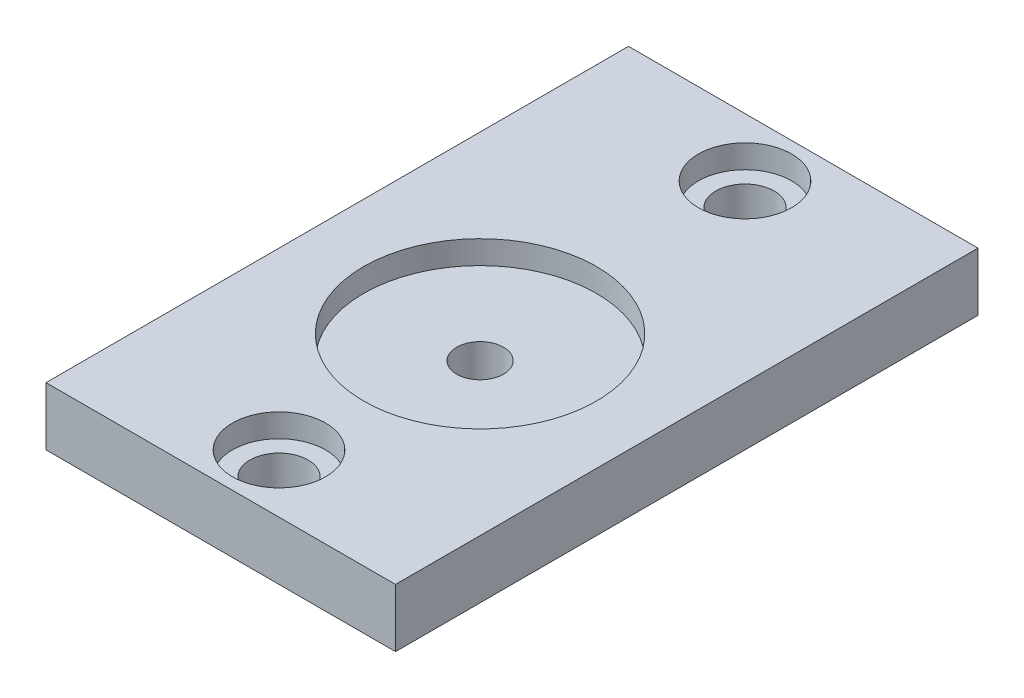
ISO-10303-21;
HEADER;
FILE_DESCRIPTION(('STEP AP214'),'2;1');
FILE_NAME('part.step','',(''),(''),'','','');
FILE_SCHEMA(('AUTOMOTIVE_DESIGN { 1 0 10303 214 1 1 1 1 }'));
ENDSEC;
DATA;
#1=APPLICATION_CONTEXT('core data for automotive mechanical design processes');
#2=APPLICATION_PROTOCOL_DEFINITION('international standard','automotive_design',2000,#1);
#3=PRODUCT_CONTEXT('',#1,'mechanical');
#4=PRODUCT('Part','Part','',(#3));
#5=PRODUCT_RELATED_PRODUCT_CATEGORY('part','',(#4));
#6=PRODUCT_DEFINITION_FORMATION('','',#4);
#7=PRODUCT_DEFINITION_CONTEXT('part definition',#1,'design');
#8=PRODUCT_DEFINITION('design','',#6,#7);
#9=PRODUCT_DEFINITION_SHAPE('','',#8);
#10=(LENGTH_UNIT() NAMED_UNIT(*) SI_UNIT(.MILLI.,.METRE.));
#11=(NAMED_UNIT(*) PLANE_ANGLE_UNIT() SI_UNIT($,.RADIAN.));
#12=(NAMED_UNIT(*) SI_UNIT($,.STERADIAN.) SOLID_ANGLE_UNIT());
#13=UNCERTAINTY_MEASURE_WITH_UNIT(LENGTH_MEASURE(1.E-05),#10,'distance_accuracy_value','');
#14=(GEOMETRIC_REPRESENTATION_CONTEXT(3) GLOBAL_UNCERTAINTY_ASSIGNED_CONTEXT((#13)) GLOBAL_UNIT_ASSIGNED_CONTEXT((#10,
#11,#12)) REPRESENTATION_CONTEXT('',''));
#15=CARTESIAN_POINT('',(0.,0.,0.));
#16=DIRECTION('',(0.,0.,1.));
#17=DIRECTION('',(1.,0.,0.));
#18=AXIS2_PLACEMENT_3D('',#15,#16,#17);
#19=CARTESIAN_POINT('',(412.75,22.225,-2235.2));
#20=DIRECTION('',(0.,1.,0.));
#21=DIRECTION('',(0.,0.,-1.));
#22=AXIS2_PLACEMENT_3D('',#19,#20,#21);
#23=PLANE('',#22);
#24=CARTESIAN_POINT('',(412.75,22.225,-2209.8));
#25=DIRECTION('',(0.,-1.,0.));
#26=DIRECTION('',(-1.,0.,0.));
#27=AXIS2_PLACEMENT_3D('',#24,#25,#26);
#28=CIRCLE('',#27,3.175);
#29=CARTESIAN_POINT('',(415.925,22.225,-2209.8));
#30=VERTEX_POINT('',#29);
#31=EDGE_CURVE('E137',#30,#30,#28,.T.);
#32=ORIENTED_EDGE('',*,*,#31,.F.);
#33=EDGE_LOOP('',(#32));
#34=FACE_BOUND('',#33,.T.);
#35=CARTESIAN_POINT('',(412.75,22.225,-2260.6));
#36=DIRECTION('',(0.,-1.,0.));
#37=DIRECTION('',(-1.,0.,0.));
#38=AXIS2_PLACEMENT_3D('',#35,#36,#37);
#39=CIRCLE('',#38,3.175);
#40=CARTESIAN_POINT('',(415.925,22.225,-2260.6));
#41=VERTEX_POINT('',#40);
#42=EDGE_CURVE('E211',#41,#41,#39,.T.);
#43=ORIENTED_EDGE('',*,*,#42,.F.);
#44=EDGE_LOOP('',(#43));
#45=FACE_BOUND('',#44,.T.);
#46=CARTESIAN_POINT('',(412.75,22.225,-2231.7202));
#47=DIRECTION('',(0.,1.,0.));
#48=DIRECTION('',(-1.,0.,0.));
#49=AXIS2_PLACEMENT_3D('',#46,#47,#48);
#50=CIRCLE('',#49,2.5527);
#51=CARTESIAN_POINT('',(415.3027,22.225,-2231.7202));
#52=VERTEX_POINT('',#51);
#53=EDGE_CURVE('E185',#52,#52,#50,.T.);
#54=ORIENTED_EDGE('',*,*,#53,.T.);
#55=EDGE_LOOP('',(#54));
#56=FACE_BOUND('',#55,.T.);
#57=DIRECTION('',(0.,0.,1.));
#58=VECTOR('',#57,1.);
#59=CARTESIAN_POINT('',(393.7,22.225,-2266.95));
#60=LINE('',#59,#58);
#61=CARTESIAN_POINT('',(393.7,22.225,-2266.95));
#62=VERTEX_POINT('',#61);
#63=CARTESIAN_POINT('',(393.7,22.225,-2203.45));
#64=VERTEX_POINT('',#63);
#65=EDGE_CURVE('E27',#62,#64,#60,.T.);
#66=ORIENTED_EDGE('',*,*,#65,.F.);
#67=DIRECTION('',(-1.,0.,0.));
#68=VECTOR('',#67,1.);
#69=CARTESIAN_POINT('',(431.8,22.225,-2266.95));
#70=LINE('',#69,#68);
#71=CARTESIAN_POINT('',(431.8,22.225,-2266.95));
#72=VERTEX_POINT('',#71);
#73=EDGE_CURVE('E172',#72,#62,#70,.T.);
#74=ORIENTED_EDGE('',*,*,#73,.F.);
#75=DIRECTION('',(0.,0.,-1.));
#76=VECTOR('',#75,1.);
#77=CARTESIAN_POINT('',(431.8,22.225,-2203.45));
#78=LINE('',#77,#76);
#79=CARTESIAN_POINT('',(431.8,22.225,-2203.45));
#80=VERTEX_POINT('',#79);
#81=EDGE_CURVE('E20',#80,#72,#78,.T.);
#82=ORIENTED_EDGE('',*,*,#81,.F.);
#83=DIRECTION('',(1.,0.,0.));
#84=VECTOR('',#83,1.);
#85=CARTESIAN_POINT('',(393.7,22.225,-2203.45));
#86=LINE('',#85,#84);
#87=EDGE_CURVE('E66',#64,#80,#86,.T.);
#88=ORIENTED_EDGE('',*,*,#87,.F.);
#89=EDGE_LOOP('',(#66,#74,#82,#88));
#90=FACE_BOUND('',#89,.T.);
#91=ADVANCED_FACE('F16',(#34,#45,#56,#90),#23,.F.);
#92=CARTESIAN_POINT('',(412.75,28.575,-2235.2));
#93=DIRECTION('',(0.,1.,0.));
#94=DIRECTION('',(0.,0.,-1.));
#95=AXIS2_PLACEMENT_3D('',#92,#93,#94);
#96=PLANE('',#95);
#97=CARTESIAN_POINT('',(412.75,28.575,-2231.7202));
#98=DIRECTION('',(0.,-1.,0.));
#99=DIRECTION('',(1.,0.,0.));
#100=AXIS2_PLACEMENT_3D('',#97,#98,#99);
#101=CIRCLE('',#100,12.7);
#102=CARTESIAN_POINT('',(400.05,28.575,-2231.7202));
#103=VERTEX_POINT('',#102);
#104=EDGE_CURVE('E192',#103,#103,#101,.T.);
#105=ORIENTED_EDGE('',*,*,#104,.T.);
#106=EDGE_LOOP('',(#105));
#107=FACE_BOUND('',#106,.T.);
#108=CARTESIAN_POINT('',(412.75,28.575,-2260.6));
#109=DIRECTION('',(0.,-1.,0.));
#110=DIRECTION('',(-1.,0.,0.));
#111=AXIS2_PLACEMENT_3D('',#108,#109,#110);
#112=CIRCLE('',#111,5.07999999999987);
#113=CARTESIAN_POINT('',(417.83,28.575,-2260.6));
#114=VERTEX_POINT('',#113);
#115=EDGE_CURVE('E184',#114,#114,#112,.T.);
#116=ORIENTED_EDGE('',*,*,#115,.T.);
#117=EDGE_LOOP('',(#116));
#118=FACE_BOUND('',#117,.T.);
#119=CARTESIAN_POINT('',(412.75,28.575,-2209.8));
#120=DIRECTION('',(0.,-1.,0.));
#121=DIRECTION('',(-1.,0.,0.));
#122=AXIS2_PLACEMENT_3D('',#119,#120,#121);
#123=CIRCLE('',#122,5.08);
#124=CARTESIAN_POINT('',(417.83,28.575,-2209.8));
#125=VERTEX_POINT('',#124);
#126=EDGE_CURVE('E188',#125,#125,#123,.T.);
#127=ORIENTED_EDGE('',*,*,#126,.T.);
#128=EDGE_LOOP('',(#127));
#129=FACE_BOUND('',#128,.T.);
#130=DIRECTION('',(0.,0.,1.));
#131=VECTOR('',#130,1.);
#132=CARTESIAN_POINT('',(393.7,28.575,-2266.95));
#133=LINE('',#132,#131);
#134=CARTESIAN_POINT('',(393.7,28.575,-2266.95));
#135=VERTEX_POINT('',#134);
#136=CARTESIAN_POINT('',(393.7,28.575,-2203.45));
#137=VERTEX_POINT('',#136);
#138=EDGE_CURVE('E10',#135,#137,#133,.T.);
#139=ORIENTED_EDGE('',*,*,#138,.T.);
#140=DIRECTION('',(1.,0.,0.));
#141=VECTOR('',#140,1.);
#142=CARTESIAN_POINT('',(393.7,28.575,-2203.45));
#143=LINE('',#142,#141);
#144=CARTESIAN_POINT('',(431.8,28.575,-2203.45));
#145=VERTEX_POINT('',#144);
#146=EDGE_CURVE('E165',#137,#145,#143,.T.);
#147=ORIENTED_EDGE('',*,*,#146,.T.);
#148=DIRECTION('',(0.,0.,-1.));
#149=VECTOR('',#148,1.);
#150=CARTESIAN_POINT('',(431.8,28.575,-2203.45));
#151=LINE('',#150,#149);
#152=CARTESIAN_POINT('',(431.8,28.575,-2266.95));
#153=VERTEX_POINT('',#152);
#154=EDGE_CURVE('E77',#145,#153,#151,.T.);
#155=ORIENTED_EDGE('',*,*,#154,.T.);
#156=DIRECTION('',(-1.,0.,0.));
#157=VECTOR('',#156,1.);
#158=CARTESIAN_POINT('',(431.8,28.575,-2266.95));
#159=LINE('',#158,#157);
#160=EDGE_CURVE('E171',#153,#135,#159,.T.);
#161=ORIENTED_EDGE('',*,*,#160,.T.);
#162=EDGE_LOOP('',(#139,#147,#155,#161));
#163=FACE_BOUND('',#162,.T.);
#164=ADVANCED_FACE('F247',(#107,#118,#129,#163),#96,.T.);
#165=CARTESIAN_POINT('',(393.7,22.225,-2266.95));
#166=DIRECTION('',(-1.,0.,0.));
#167=DIRECTION('',(0.,0.,1.));
#168=AXIS2_PLACEMENT_3D('',#165,#166,#167);
#169=PLANE('',#168);
#170=ORIENTED_EDGE('',*,*,#65,.T.);
#171=DIRECTION('',(0.,1.,0.));
#172=VECTOR('',#171,1.);
#173=CARTESIAN_POINT('',(393.7,22.225,-2203.45));
#174=LINE('',#173,#172);
#175=EDGE_CURVE('E173',#64,#137,#174,.T.);
#176=ORIENTED_EDGE('',*,*,#175,.T.);
#177=ORIENTED_EDGE('',*,*,#138,.F.);
#178=DIRECTION('',(0.,1.,0.));
#179=VECTOR('',#178,1.);
#180=CARTESIAN_POINT('',(393.7,22.225,-2266.95));
#181=LINE('',#180,#179);
#182=EDGE_CURVE('E167',#62,#135,#181,.T.);
#183=ORIENTED_EDGE('',*,*,#182,.F.);
#184=EDGE_LOOP('',(#170,#176,#177,#183));
#185=FACE_BOUND('',#184,.T.);
#186=ADVANCED_FACE('F273',(#185),#169,.T.);
#187=CARTESIAN_POINT('',(393.7,22.225,-2203.45));
#188=DIRECTION('',(0.,0.,1.));
#189=DIRECTION('',(1.,0.,0.));
#190=AXIS2_PLACEMENT_3D('',#187,#188,#189);
#191=PLANE('',#190);
#192=ORIENTED_EDGE('',*,*,#87,.T.);
#193=DIRECTION('',(0.,1.,0.));
#194=VECTOR('',#193,1.);
#195=CARTESIAN_POINT('',(431.8,22.225,-2203.45));
#196=LINE('',#195,#194);
#197=EDGE_CURVE('E166',#80,#145,#196,.T.);
#198=ORIENTED_EDGE('',*,*,#197,.T.);
#199=ORIENTED_EDGE('',*,*,#146,.F.);
#200=ORIENTED_EDGE('',*,*,#175,.F.);
#201=EDGE_LOOP('',(#192,#198,#199,#200));
#202=FACE_BOUND('',#201,.T.);
#203=ADVANCED_FACE('F18',(#202),#191,.T.);
#204=CARTESIAN_POINT('',(431.8,22.225,-2203.45));
#205=DIRECTION('',(1.,0.,0.));
#206=DIRECTION('',(0.,0.,1.));
#207=AXIS2_PLACEMENT_3D('',#204,#205,#206);
#208=PLANE('',#207);
#209=ORIENTED_EDGE('',*,*,#81,.T.);
#210=DIRECTION('',(0.,1.,0.));
#211=VECTOR('',#210,1.);
#212=CARTESIAN_POINT('',(431.8,22.225,-2266.95));
#213=LINE('',#212,#211);
#214=EDGE_CURVE('E176',#72,#153,#213,.T.);
#215=ORIENTED_EDGE('',*,*,#214,.T.);
#216=ORIENTED_EDGE('',*,*,#154,.F.);
#217=ORIENTED_EDGE('',*,*,#197,.F.);
#218=EDGE_LOOP('',(#209,#215,#216,#217));
#219=FACE_BOUND('',#218,.T.);
#220=ADVANCED_FACE('F286',(#219),#208,.T.);
#221=CARTESIAN_POINT('',(431.8,22.225,-2266.95));
#222=DIRECTION('',(0.,0.,-1.));
#223=DIRECTION('',(0.,-1.,0.));
#224=AXIS2_PLACEMENT_3D('',#221,#222,#223);
#225=PLANE('',#224);
#226=ORIENTED_EDGE('',*,*,#73,.T.);
#227=ORIENTED_EDGE('',*,*,#182,.T.);
#228=ORIENTED_EDGE('',*,*,#160,.F.);
#229=ORIENTED_EDGE('',*,*,#214,.F.);
#230=EDGE_LOOP('',(#226,#227,#228,#229));
#231=FACE_BOUND('',#230,.T.);
#232=ADVANCED_FACE('F283',(#231),#225,.T.);
#233=CARTESIAN_POINT('',(412.75,22.225,-2260.6));
#234=DIRECTION('',(0.,1.,0.));
#235=DIRECTION('',(-1.,0.,0.));
#236=AXIS2_PLACEMENT_3D('',#233,#234,#235);
#237=CYLINDRICAL_SURFACE('',#236,3.175);
#238=CARTESIAN_POINT('',(412.75,26.035,-2260.6));
#239=DIRECTION('',(0.,1.,0.));
#240=DIRECTION('',(-1.,0.,0.));
#241=AXIS2_PLACEMENT_3D('',#238,#239,#240);
#242=CIRCLE('',#241,3.175);
#243=CARTESIAN_POINT('',(415.925,26.035,-2260.6));
#244=VERTEX_POINT('',#243);
#245=EDGE_CURVE('E157',#244,#244,#242,.T.);
#246=ORIENTED_EDGE('',*,*,#245,.T.);
#247=DIRECTION('',(0.,-1.,0.));
#248=VECTOR('',#247,1.);
#249=CARTESIAN_POINT('',(415.925,22.225,-2260.6));
#250=LINE('',#249,#248);
#251=EDGE_CURVE('E89',#244,#41,#250,.T.);
#252=ORIENTED_EDGE('',*,*,#251,.T.);
#253=ORIENTED_EDGE('',*,*,#42,.T.);
#254=ORIENTED_EDGE('',*,*,#251,.F.);
#255=EDGE_LOOP('',(#246,#252,#253,#254));
#256=FACE_BOUND('',#255,.T.);
#257=ADVANCED_FACE('F285',(#256),#237,.F.);
#258=CARTESIAN_POINT('',(412.75,22.225,-2209.8));
#259=DIRECTION('',(0.,1.,0.));
#260=DIRECTION('',(-1.,0.,0.));
#261=AXIS2_PLACEMENT_3D('',#258,#259,#260);
#262=CYLINDRICAL_SURFACE('',#261,3.175);
#263=CARTESIAN_POINT('',(412.75,26.035,-2209.8));
#264=DIRECTION('',(0.,1.,0.));
#265=DIRECTION('',(-1.,0.,0.));
#266=AXIS2_PLACEMENT_3D('',#263,#264,#265);
#267=CIRCLE('',#266,3.175);
#268=CARTESIAN_POINT('',(415.925,26.035,-2209.8));
#269=VERTEX_POINT('',#268);
#270=EDGE_CURVE('E144',#269,#269,#267,.T.);
#271=ORIENTED_EDGE('',*,*,#270,.T.);
#272=DIRECTION('',(0.,-1.,0.));
#273=VECTOR('',#272,1.);
#274=CARTESIAN_POINT('',(415.925,22.225,-2209.8));
#275=LINE('',#274,#273);
#276=EDGE_CURVE('E141',#269,#30,#275,.T.);
#277=ORIENTED_EDGE('',*,*,#276,.T.);
#278=ORIENTED_EDGE('',*,*,#31,.T.);
#279=ORIENTED_EDGE('',*,*,#276,.F.);
#280=EDGE_LOOP('',(#271,#277,#278,#279));
#281=FACE_BOUND('',#280,.T.);
#282=ADVANCED_FACE('F142',(#281),#262,.F.);
#283=CARTESIAN_POINT('',(412.75,26.035,-2231.7202));
#284=DIRECTION('',(0.,-1.,0.));
#285=DIRECTION('',(0.,0.,-1.));
#286=AXIS2_PLACEMENT_3D('',#283,#284,#285);
#287=PLANE('',#286);
#288=CARTESIAN_POINT('',(412.75,26.035,-2231.7202));
#289=DIRECTION('',(0.,-1.,0.));
#290=DIRECTION('',(-1.,0.,0.));
#291=AXIS2_PLACEMENT_3D('',#288,#289,#290);
#292=CIRCLE('',#291,2.5527);
#293=CARTESIAN_POINT('',(415.3027,26.035,-2231.7202));
#294=VERTEX_POINT('',#293);
#295=EDGE_CURVE('E213',#294,#294,#292,.T.);
#296=ORIENTED_EDGE('',*,*,#295,.T.);
#297=EDGE_LOOP('',(#296));
#298=FACE_BOUND('',#297,.T.);
#299=CARTESIAN_POINT('',(412.75,26.035,-2231.7202));
#300=DIRECTION('',(0.,-1.,0.));
#301=DIRECTION('',(1.,0.,0.));
#302=AXIS2_PLACEMENT_3D('',#299,#300,#301);
#303=CIRCLE('',#302,12.7);
#304=CARTESIAN_POINT('',(400.05,26.035,-2231.7202));
#305=VERTEX_POINT('',#304);
#306=EDGE_CURVE('E128',#305,#305,#303,.T.);
#307=ORIENTED_EDGE('',*,*,#306,.F.);
#308=EDGE_LOOP('',(#307));
#309=FACE_BOUND('',#308,.T.);
#310=ADVANCED_FACE('F252',(#298,#309),#287,.F.);
#311=CARTESIAN_POINT('',(412.75,28.575,-2231.7202));
#312=DIRECTION('',(0.,-1.,0.));
#313=DIRECTION('',(1.,0.,0.));
#314=AXIS2_PLACEMENT_3D('',#311,#312,#313);
#315=CYLINDRICAL_SURFACE('',#314,12.7);
#316=ORIENTED_EDGE('',*,*,#104,.F.);
#317=DIRECTION('',(0.,-1.,0.));
#318=VECTOR('',#317,1.);
#319=CARTESIAN_POINT('',(400.05,28.575,-2231.7202));
#320=LINE('',#319,#318);
#321=EDGE_CURVE('E153',#103,#305,#320,.T.);
#322=ORIENTED_EDGE('',*,*,#321,.T.);
#323=ORIENTED_EDGE('',*,*,#306,.T.);
#324=ORIENTED_EDGE('',*,*,#321,.F.);
#325=EDGE_LOOP('',(#316,#322,#323,#324));
#326=FACE_BOUND('',#325,.T.);
#327=ADVANCED_FACE('F249',(#326),#315,.F.);
#328=CARTESIAN_POINT('',(412.75,26.035,-2260.6));
#329=DIRECTION('',(0.,1.,0.));
#330=DIRECTION('',(0.,0.,-1.));
#331=AXIS2_PLACEMENT_3D('',#328,#329,#330);
#332=PLANE('',#331);
#333=ORIENTED_EDGE('',*,*,#245,.F.);
#334=EDGE_LOOP('',(#333));
#335=FACE_BOUND('',#334,.T.);
#336=CARTESIAN_POINT('',(412.75,26.035,-2260.6));
#337=DIRECTION('',(0.,-1.,0.));
#338=DIRECTION('',(-1.,0.,0.));
#339=AXIS2_PLACEMENT_3D('',#336,#337,#338);
#340=CIRCLE('',#339,5.07999999999987);
#341=CARTESIAN_POINT('',(417.83,26.035,-2260.6));
#342=VERTEX_POINT('',#341);
#343=EDGE_CURVE('E103',#342,#342,#340,.T.);
#344=ORIENTED_EDGE('',*,*,#343,.F.);
#345=EDGE_LOOP('',(#344));
#346=FACE_BOUND('',#345,.T.);
#347=ADVANCED_FACE('F251',(#335,#346),#332,.T.);
#348=CARTESIAN_POINT('',(412.75,28.575,-2260.6));
#349=DIRECTION('',(0.,-1.,0.));
#350=DIRECTION('',(-1.,0.,0.));
#351=AXIS2_PLACEMENT_3D('',#348,#349,#350);
#352=CYLINDRICAL_SURFACE('',#351,5.07999999999987);
#353=ORIENTED_EDGE('',*,*,#115,.F.);
#354=DIRECTION('',(0.,-1.,0.));
#355=VECTOR('',#354,1.);
#356=CARTESIAN_POINT('',(417.83,28.575,-2260.6));
#357=LINE('',#356,#355);
#358=EDGE_CURVE('E181',#114,#342,#357,.T.);
#359=ORIENTED_EDGE('',*,*,#358,.T.);
#360=ORIENTED_EDGE('',*,*,#343,.T.);
#361=ORIENTED_EDGE('',*,*,#358,.F.);
#362=EDGE_LOOP('',(#353,#359,#360,#361));
#363=FACE_BOUND('',#362,.T.);
#364=ADVANCED_FACE('F260',(#363),#352,.F.);
#365=CARTESIAN_POINT('',(412.75,26.035,-2209.8));
#366=DIRECTION('',(0.,1.,0.));
#367=DIRECTION('',(0.,0.,-1.));
#368=AXIS2_PLACEMENT_3D('',#365,#366,#367);
#369=PLANE('',#368);
#370=ORIENTED_EDGE('',*,*,#270,.F.);
#371=EDGE_LOOP('',(#370));
#372=FACE_BOUND('',#371,.T.);
#373=CARTESIAN_POINT('',(412.75,26.035,-2209.8));
#374=DIRECTION('',(0.,-1.,0.));
#375=DIRECTION('',(-1.,0.,0.));
#376=AXIS2_PLACEMENT_3D('',#373,#374,#375);
#377=CIRCLE('',#376,5.08);
#378=CARTESIAN_POINT('',(417.83,26.035,-2209.8));
#379=VERTEX_POINT('',#378);
#380=EDGE_CURVE('E159',#379,#379,#377,.T.);
#381=ORIENTED_EDGE('',*,*,#380,.F.);
#382=EDGE_LOOP('',(#381));
#383=FACE_BOUND('',#382,.T.);
#384=ADVANCED_FACE('F281',(#372,#383),#369,.T.);
#385=CARTESIAN_POINT('',(412.75,28.575,-2209.8));
#386=DIRECTION('',(0.,-1.,0.));
#387=DIRECTION('',(-1.,0.,0.));
#388=AXIS2_PLACEMENT_3D('',#385,#386,#387);
#389=CYLINDRICAL_SURFACE('',#388,5.08);
#390=ORIENTED_EDGE('',*,*,#126,.F.);
#391=DIRECTION('',(0.,-1.,0.));
#392=VECTOR('',#391,1.);
#393=CARTESIAN_POINT('',(417.83,28.575,-2209.8));
#394=LINE('',#393,#392);
#395=EDGE_CURVE('E161',#125,#379,#394,.T.);
#396=ORIENTED_EDGE('',*,*,#395,.T.);
#397=ORIENTED_EDGE('',*,*,#380,.T.);
#398=ORIENTED_EDGE('',*,*,#395,.F.);
#399=EDGE_LOOP('',(#390,#396,#397,#398));
#400=FACE_BOUND('',#399,.T.);
#401=ADVANCED_FACE('F278',(#400),#389,.F.);
#402=CARTESIAN_POINT('',(412.75,28.575,-2231.7202));
#403=DIRECTION('',(0.,-1.,0.));
#404=DIRECTION('',(-1.,0.,0.));
#405=AXIS2_PLACEMENT_3D('',#402,#403,#404);
#406=CYLINDRICAL_SURFACE('',#405,2.5527);
#407=ORIENTED_EDGE('',*,*,#295,.F.);
#408=DIRECTION('',(0.,-1.,0.));
#409=VECTOR('',#408,1.);
#410=CARTESIAN_POINT('',(415.3027,28.575,-2231.7202));
#411=LINE('',#410,#409);
#412=EDGE_CURVE('E189',#294,#52,#411,.T.);
#413=ORIENTED_EDGE('',*,*,#412,.T.);
#414=ORIENTED_EDGE('',*,*,#53,.F.);
#415=ORIENTED_EDGE('',*,*,#412,.F.);
#416=EDGE_LOOP('',(#407,#413,#414,#415));
#417=FACE_BOUND('',#416,.T.);
#418=ADVANCED_FACE('F280',(#417),#406,.F.);
#419=CLOSED_SHELL('',(#91,#164,#186,#203,#220,#232,#257,#282,#310,#327,#347,#364,#384,#401,#418));
#420=MANIFOLD_SOLID_BREP('B1',#419);
#421=ADVANCED_BREP_SHAPE_REPRESENTATION('',(#18,#420),#14);
#422=SHAPE_DEFINITION_REPRESENTATION(#9,#421);
ENDSEC;
END-ISO-10303-21;
